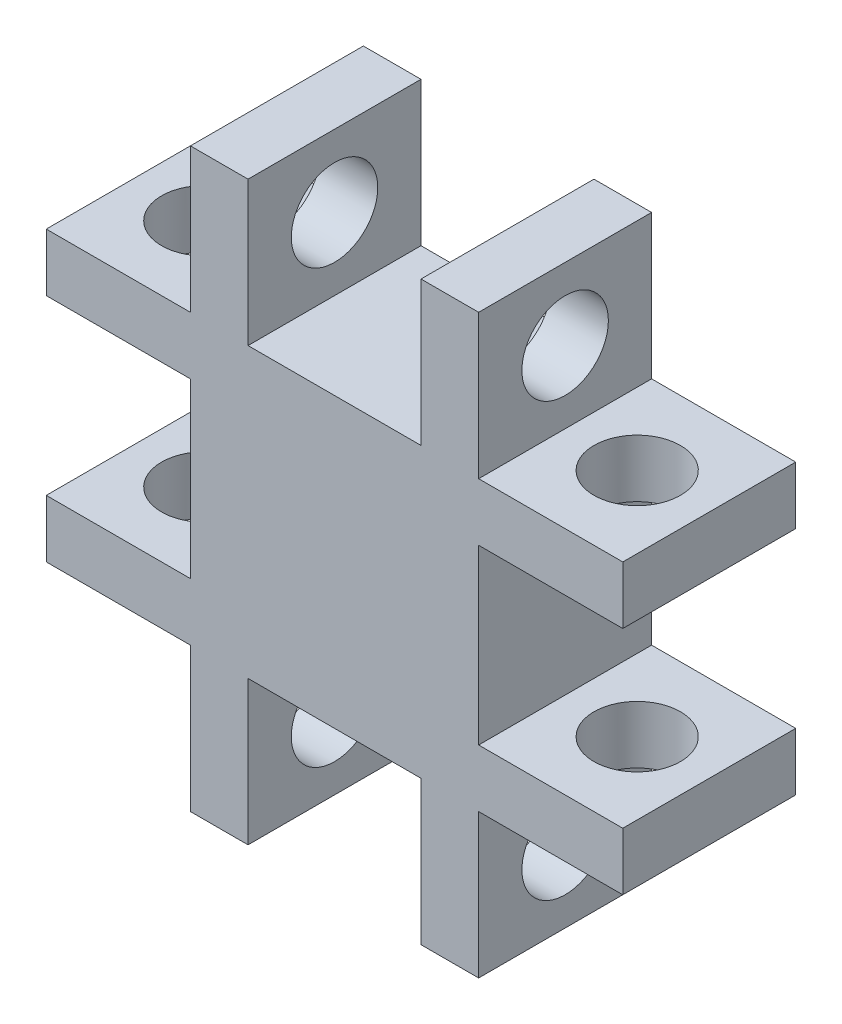
ISO-10303-21;
HEADER;
FILE_DESCRIPTION(('STEP AP214'),'2;1');
FILE_NAME('part.step','',(''),(''),'','','');
FILE_SCHEMA(('AUTOMOTIVE_DESIGN { 1 0 10303 214 1 1 1 1 }'));
ENDSEC;
DATA;
#1=APPLICATION_CONTEXT('core data for automotive mechanical design processes');
#2=APPLICATION_PROTOCOL_DEFINITION('international standard','automotive_design',2000,#1);
#3=PRODUCT_CONTEXT('',#1,'mechanical');
#4=PRODUCT('Part','Part','',(#3));
#5=PRODUCT_RELATED_PRODUCT_CATEGORY('part','',(#4));
#6=PRODUCT_DEFINITION_FORMATION('','',#4);
#7=PRODUCT_DEFINITION_CONTEXT('part definition',#1,'design');
#8=PRODUCT_DEFINITION('design','',#6,#7);
#9=PRODUCT_DEFINITION_SHAPE('','',#8);
#10=(LENGTH_UNIT() NAMED_UNIT(*) SI_UNIT(.MILLI.,.METRE.));
#11=(NAMED_UNIT(*) PLANE_ANGLE_UNIT() SI_UNIT($,.RADIAN.));
#12=(NAMED_UNIT(*) SI_UNIT($,.STERADIAN.) SOLID_ANGLE_UNIT());
#13=UNCERTAINTY_MEASURE_WITH_UNIT(LENGTH_MEASURE(1.E-05),#10,'distance_accuracy_value','');
#14=(GEOMETRIC_REPRESENTATION_CONTEXT(3) GLOBAL_UNCERTAINTY_ASSIGNED_CONTEXT((#13)) GLOBAL_UNIT_ASSIGNED_CONTEXT((#10,
#11,#12)) REPRESENTATION_CONTEXT('',''));
#15=CARTESIAN_POINT('',(0.,0.,0.));
#16=DIRECTION('',(0.,0.,1.));
#17=DIRECTION('',(1.,0.,0.));
#18=AXIS2_PLACEMENT_3D('',#15,#16,#17);
#19=CARTESIAN_POINT('',(-50.,50.,60.));
#20=DIRECTION('',(0.,-1.,0.));
#21=DIRECTION('',(0.,0.,-1.));
#22=AXIS2_PLACEMENT_3D('',#19,#20,#21);
#23=PLANE('',#22);
#24=CARTESIAN_POINT('',(75.,50.,30.));
#25=DIRECTION('',(0.,-1.,0.));
#26=DIRECTION('',(0.,0.,-1.));
#27=AXIS2_PLACEMENT_3D('',#24,#25,#26);
#28=CIRCLE('',#27,15.);
#29=CARTESIAN_POINT('',(75.,50.,15.));
#30=VERTEX_POINT('',#29);
#31=EDGE_CURVE('E406',#30,#30,#28,.T.);
#32=ORIENTED_EDGE('',*,*,#31,.T.);
#33=EDGE_LOOP('',(#32));
#34=FACE_BOUND('',#33,.T.);
#35=DIRECTION('',(-1.,0.,0.));
#36=VECTOR('',#35,1.);
#37=CARTESIAN_POINT('',(-50.,50.,0.));
#38=LINE('',#37,#36);
#39=CARTESIAN_POINT('',(100.,50.,0.));
#40=VERTEX_POINT('',#39);
#41=CARTESIAN_POINT('',(50.,50.,0.));
#42=VERTEX_POINT('',#41);
#43=EDGE_CURVE('E551',#40,#42,#38,.T.);
#44=ORIENTED_EDGE('',*,*,#43,.T.);
#45=DIRECTION('',(0.,0.,1.));
#46=VECTOR('',#45,1.);
#47=CARTESIAN_POINT('',(50.,50.,60.));
#48=LINE('',#47,#46);
#49=CARTESIAN_POINT('',(50.,50.,60.));
#50=VERTEX_POINT('',#49);
#51=EDGE_CURVE('E65',#42,#50,#48,.T.);
#52=ORIENTED_EDGE('',*,*,#51,.T.);
#53=DIRECTION('',(-1.,0.,0.));
#54=VECTOR('',#53,1.);
#55=CARTESIAN_POINT('',(-50.,50.,60.));
#56=LINE('',#55,#54);
#57=CARTESIAN_POINT('',(100.,50.,60.));
#58=VERTEX_POINT('',#57);
#59=EDGE_CURVE('E540',#58,#50,#56,.T.);
#60=ORIENTED_EDGE('',*,*,#59,.F.);
#61=DIRECTION('',(0.,0.,1.));
#62=VECTOR('',#61,1.);
#63=CARTESIAN_POINT('',(100.,50.,60.));
#64=LINE('',#63,#62);
#65=EDGE_CURVE('E519',#40,#58,#64,.T.);
#66=ORIENTED_EDGE('',*,*,#65,.F.);
#67=EDGE_LOOP('',(#44,#52,#60,#66));
#68=FACE_BOUND('',#67,.T.);
#69=ADVANCED_FACE('F39',(#34,#68),#23,.F.);
#70=CARTESIAN_POINT('',(-75.,49.9999999999999,30.));
#71=DIRECTION('',(0.,1.,0.));
#72=DIRECTION('',(0.,0.,-1.));
#73=AXIS2_PLACEMENT_3D('',#70,#71,#72);
#74=CIRCLE('',#73,15.);
#75=CARTESIAN_POINT('',(-75.,49.9999999999999,15.));
#76=VERTEX_POINT('',#75);
#77=EDGE_CURVE('E312',#76,#76,#74,.T.);
#78=ORIENTED_EDGE('',*,*,#77,.F.);
#79=EDGE_LOOP('',(#78));
#80=FACE_BOUND('',#79,.T.);
#81=CARTESIAN_POINT('',(-50.,50.,60.));
#82=VERTEX_POINT('',#81);
#83=CARTESIAN_POINT('',(-100.,50.,60.));
#84=VERTEX_POINT('',#83);
#85=EDGE_CURVE('E538',#82,#84,#56,.T.);
#86=ORIENTED_EDGE('',*,*,#85,.F.);
#87=DIRECTION('',(0.,0.,-1.));
#88=VECTOR('',#87,1.);
#89=CARTESIAN_POINT('',(-50.,50.,60.));
#90=LINE('',#89,#88);
#91=CARTESIAN_POINT('',(-50.,50.,0.));
#92=VERTEX_POINT('',#91);
#93=EDGE_CURVE('E237',#82,#92,#90,.T.);
#94=ORIENTED_EDGE('',*,*,#93,.T.);
#95=CARTESIAN_POINT('',(-100.,50.,0.));
#96=VERTEX_POINT('',#95);
#97=EDGE_CURVE('E550',#92,#96,#38,.T.);
#98=ORIENTED_EDGE('',*,*,#97,.T.);
#99=DIRECTION('',(0.,0.,1.));
#100=VECTOR('',#99,1.);
#101=CARTESIAN_POINT('',(-100.,50.,60.));
#102=LINE('',#101,#100);
#103=EDGE_CURVE('E371',#96,#84,#102,.T.);
#104=ORIENTED_EDGE('',*,*,#103,.T.);
#105=EDGE_LOOP('',(#86,#94,#98,#104));
#106=FACE_BOUND('',#105,.T.);
#107=ADVANCED_FACE('F588',(#80,#106),#23,.F.);
#108=CARTESIAN_POINT('',(-50.,50.,60.));
#109=DIRECTION('',(1.,0.,0.));
#110=DIRECTION('',(0.,1.,0.));
#111=AXIS2_PLACEMENT_3D('',#108,#109,#110);
#112=PLANE('',#111);
#113=DIRECTION('',(0.,-1.,0.));
#114=VECTOR('',#113,1.);
#115=CARTESIAN_POINT('',(-50.,50.,0.));
#116=LINE('',#115,#114);
#117=CARTESIAN_POINT('',(-50.,30.,0.));
#118=VERTEX_POINT('',#117);
#119=CARTESIAN_POINT('',(-50.,-30.,0.));
#120=VERTEX_POINT('',#119);
#121=EDGE_CURVE('E556',#118,#120,#116,.T.);
#122=ORIENTED_EDGE('',*,*,#121,.T.);
#123=DIRECTION('',(0.,0.,1.));
#124=VECTOR('',#123,1.);
#125=CARTESIAN_POINT('',(-50.,-30.,60.));
#126=LINE('',#125,#124);
#127=CARTESIAN_POINT('',(-50.,-30.,60.));
#128=VERTEX_POINT('',#127);
#129=EDGE_CURVE('E327',#120,#128,#126,.T.);
#130=ORIENTED_EDGE('',*,*,#129,.T.);
#131=DIRECTION('',(0.,-1.,0.));
#132=VECTOR('',#131,1.);
#133=CARTESIAN_POINT('',(-50.,50.,60.));
#134=LINE('',#133,#132);
#135=CARTESIAN_POINT('',(-50.,30.,60.));
#136=VERTEX_POINT('',#135);
#137=EDGE_CURVE('E544',#136,#128,#134,.T.);
#138=ORIENTED_EDGE('',*,*,#137,.F.);
#139=DIRECTION('',(0.,0.,-1.));
#140=VECTOR('',#139,1.);
#141=CARTESIAN_POINT('',(-50.,30.,60.));
#142=LINE('',#141,#140);
#143=EDGE_CURVE('E366',#136,#118,#142,.T.);
#144=ORIENTED_EDGE('',*,*,#143,.T.);
#145=EDGE_LOOP('',(#122,#130,#138,#144));
#146=FACE_BOUND('',#145,.T.);
#147=ADVANCED_FACE('F594',(#146),#112,.F.);
#148=CARTESIAN_POINT('',(-50.,-50.,60.));
#149=DIRECTION('',(0.,1.,0.));
#150=DIRECTION('',(0.,0.,1.));
#151=AXIS2_PLACEMENT_3D('',#148,#149,#150);
#152=PLANE('',#151);
#153=CARTESIAN_POINT('',(75.,-50.,30.));
#154=DIRECTION('',(0.,-1.,0.));
#155=DIRECTION('',(0.,0.,-1.));
#156=AXIS2_PLACEMENT_3D('',#153,#154,#155);
#157=CIRCLE('',#156,15.);
#158=CARTESIAN_POINT('',(75.,-50.,15.));
#159=VERTEX_POINT('',#158);
#160=EDGE_CURVE('E405',#159,#159,#157,.T.);
#161=ORIENTED_EDGE('',*,*,#160,.F.);
#162=EDGE_LOOP('',(#161));
#163=FACE_BOUND('',#162,.T.);
#164=DIRECTION('',(0.,0.,1.));
#165=VECTOR('',#164,1.);
#166=CARTESIAN_POINT('',(50.,-50.,60.));
#167=LINE('',#166,#165);
#168=CARTESIAN_POINT('',(50.,-50.,0.));
#169=VERTEX_POINT('',#168);
#170=CARTESIAN_POINT('',(50.,-50.,60.));
#171=VERTEX_POINT('',#170);
#172=EDGE_CURVE('E418',#169,#171,#167,.T.);
#173=ORIENTED_EDGE('',*,*,#172,.F.);
#174=DIRECTION('',(1.,0.,0.));
#175=VECTOR('',#174,1.);
#176=CARTESIAN_POINT('',(-50.,-50.,0.));
#177=LINE('',#176,#175);
#178=CARTESIAN_POINT('',(100.,-50.,0.));
#179=VERTEX_POINT('',#178);
#180=EDGE_CURVE('E559',#169,#179,#177,.T.);
#181=ORIENTED_EDGE('',*,*,#180,.T.);
#182=DIRECTION('',(0.,0.,-1.));
#183=VECTOR('',#182,1.);
#184=CARTESIAN_POINT('',(100.,-50.,60.));
#185=LINE('',#184,#183);
#186=CARTESIAN_POINT('',(100.,-50.,60.));
#187=VERTEX_POINT('',#186);
#188=EDGE_CURVE('E486',#187,#179,#185,.T.);
#189=ORIENTED_EDGE('',*,*,#188,.F.);
#190=DIRECTION('',(1.,0.,0.));
#191=VECTOR('',#190,1.);
#192=CARTESIAN_POINT('',(-50.,-50.,60.));
#193=LINE('',#192,#191);
#194=EDGE_CURVE('E49',#171,#187,#193,.T.);
#195=ORIENTED_EDGE('',*,*,#194,.F.);
#196=EDGE_LOOP('',(#173,#181,#189,#195));
#197=FACE_BOUND('',#196,.T.);
#198=ADVANCED_FACE('F610',(#163,#197),#152,.F.);
#199=DIRECTION('',(0.,0.,-1.));
#200=VECTOR('',#199,1.);
#201=CARTESIAN_POINT('',(30.,-50.,60.));
#202=LINE('',#201,#200);
#203=CARTESIAN_POINT('',(30.,-50.,60.));
#204=VERTEX_POINT('',#203);
#205=CARTESIAN_POINT('',(30.,-50.,0.));
#206=VERTEX_POINT('',#205);
#207=EDGE_CURVE('E424',#204,#206,#202,.T.);
#208=ORIENTED_EDGE('',*,*,#207,.F.);
#209=CARTESIAN_POINT('',(-30.,-50.,60.));
#210=VERTEX_POINT('',#209);
#211=EDGE_CURVE('E11',#210,#204,#193,.T.);
#212=ORIENTED_EDGE('',*,*,#211,.F.);
#213=DIRECTION('',(0.,0.,1.));
#214=VECTOR('',#213,1.);
#215=CARTESIAN_POINT('',(-30.,-50.,60.));
#216=LINE('',#215,#214);
#217=CARTESIAN_POINT('',(-30.,-50.,0.));
#218=VERTEX_POINT('',#217);
#219=EDGE_CURVE('E455',#218,#210,#216,.T.);
#220=ORIENTED_EDGE('',*,*,#219,.F.);
#221=EDGE_CURVE('E539',#218,#206,#177,.T.);
#222=ORIENTED_EDGE('',*,*,#221,.T.);
#223=EDGE_LOOP('',(#208,#212,#220,#222));
#224=FACE_BOUND('',#223,.T.);
#225=ADVANCED_FACE('F605',(#224),#152,.F.);
#226=CARTESIAN_POINT('',(50.,50.,60.));
#227=DIRECTION('',(-1.,0.,0.));
#228=DIRECTION('',(0.,-1.,0.));
#229=AXIS2_PLACEMENT_3D('',#226,#227,#228);
#230=PLANE('',#229);
#231=DIRECTION('',(0.,0.,1.));
#232=VECTOR('',#231,1.);
#233=CARTESIAN_POINT('',(50.,-30.,60.));
#234=LINE('',#233,#232);
#235=CARTESIAN_POINT('',(50.,-30.,0.));
#236=VERTEX_POINT('',#235);
#237=CARTESIAN_POINT('',(50.,-30.,60.));
#238=VERTEX_POINT('',#237);
#239=EDGE_CURVE('E481',#236,#238,#234,.T.);
#240=ORIENTED_EDGE('',*,*,#239,.F.);
#241=DIRECTION('',(0.,1.,0.));
#242=VECTOR('',#241,1.);
#243=CARTESIAN_POINT('',(50.,50.,0.));
#244=LINE('',#243,#242);
#245=CARTESIAN_POINT('',(50.,30.,0.));
#246=VERTEX_POINT('',#245);
#247=EDGE_CURVE('E534',#236,#246,#244,.T.);
#248=ORIENTED_EDGE('',*,*,#247,.T.);
#249=DIRECTION('',(0.,0.,-1.));
#250=VECTOR('',#249,1.);
#251=CARTESIAN_POINT('',(50.,30.,60.));
#252=LINE('',#251,#250);
#253=CARTESIAN_POINT('',(50.,30.,60.));
#254=VERTEX_POINT('',#253);
#255=EDGE_CURVE('E507',#254,#246,#252,.T.);
#256=ORIENTED_EDGE('',*,*,#255,.F.);
#257=DIRECTION('',(0.,1.,0.));
#258=VECTOR('',#257,1.);
#259=CARTESIAN_POINT('',(50.,50.,60.));
#260=LINE('',#259,#258);
#261=EDGE_CURVE('E535',#238,#254,#260,.T.);
#262=ORIENTED_EDGE('',*,*,#261,.F.);
#263=EDGE_LOOP('',(#240,#248,#256,#262));
#264=FACE_BOUND('',#263,.T.);
#265=ADVANCED_FACE('F41',(#264),#230,.F.);
#266=CARTESIAN_POINT('',(30.,50.,60.));
#267=VERTEX_POINT('',#266);
#268=CARTESIAN_POINT('',(-30.,50.,60.));
#269=VERTEX_POINT('',#268);
#270=EDGE_CURVE('E57',#267,#269,#56,.T.);
#271=ORIENTED_EDGE('',*,*,#270,.F.);
#272=DIRECTION('',(0.,0.,-1.));
#273=VECTOR('',#272,1.);
#274=CARTESIAN_POINT('',(30.,50.,60.));
#275=LINE('',#274,#273);
#276=CARTESIAN_POINT('',(30.,50.,0.));
#277=VERTEX_POINT('',#276);
#278=EDGE_CURVE('E249',#267,#277,#275,.T.);
#279=ORIENTED_EDGE('',*,*,#278,.T.);
#280=CARTESIAN_POINT('',(-30.,50.,0.));
#281=VERTEX_POINT('',#280);
#282=EDGE_CURVE('E555',#277,#281,#38,.T.);
#283=ORIENTED_EDGE('',*,*,#282,.T.);
#284=DIRECTION('',(0.,0.,1.));
#285=VECTOR('',#284,1.);
#286=CARTESIAN_POINT('',(-30.,50.,60.));
#287=LINE('',#286,#285);
#288=EDGE_CURVE('E280',#281,#269,#287,.T.);
#289=ORIENTED_EDGE('',*,*,#288,.T.);
#290=EDGE_LOOP('',(#271,#279,#283,#289));
#291=FACE_BOUND('',#290,.T.);
#292=ADVANCED_FACE('F590',(#291),#23,.F.);
#293=CARTESIAN_POINT('',(-50.,-75.,30.));
#294=DIRECTION('',(1.,0.,0.));
#295=DIRECTION('',(0.,0.,-1.));
#296=AXIS2_PLACEMENT_3D('',#293,#294,#295);
#297=CIRCLE('',#296,15.);
#298=CARTESIAN_POINT('',(-50.,-75.,15.));
#299=VERTEX_POINT('',#298);
#300=EDGE_CURVE('E393',#299,#299,#297,.T.);
#301=ORIENTED_EDGE('',*,*,#300,.T.);
#302=EDGE_LOOP('',(#301));
#303=FACE_BOUND('',#302,.T.);
#304=CARTESIAN_POINT('',(-50.,-50.,60.));
#305=VERTEX_POINT('',#304);
#306=CARTESIAN_POINT('',(-50.,-100.,60.));
#307=VERTEX_POINT('',#306);
#308=EDGE_CURVE('E543',#305,#307,#134,.T.);
#309=ORIENTED_EDGE('',*,*,#308,.F.);
#310=DIRECTION('',(0.,0.,-1.));
#311=VECTOR('',#310,1.);
#312=CARTESIAN_POINT('',(-50.,-50.,60.));
#313=LINE('',#312,#311);
#314=CARTESIAN_POINT('',(-50.,-50.,0.));
#315=VERTEX_POINT('',#314);
#316=EDGE_CURVE('E333',#305,#315,#313,.T.);
#317=ORIENTED_EDGE('',*,*,#316,.T.);
#318=CARTESIAN_POINT('',(-50.,-100.,0.));
#319=VERTEX_POINT('',#318);
#320=EDGE_CURVE('E554',#315,#319,#116,.T.);
#321=ORIENTED_EDGE('',*,*,#320,.T.);
#322=DIRECTION('',(0.,0.,-1.));
#323=VECTOR('',#322,1.);
#324=CARTESIAN_POINT('',(-50.,-100.,60.));
#325=LINE('',#324,#323);
#326=EDGE_CURVE('E456',#307,#319,#325,.T.);
#327=ORIENTED_EDGE('',*,*,#326,.F.);
#328=EDGE_LOOP('',(#309,#317,#321,#327));
#329=FACE_BOUND('',#328,.T.);
#330=ADVANCED_FACE('F598',(#303,#329),#112,.F.);
#331=CARTESIAN_POINT('',(0.,0.,60.));
#332=DIRECTION('',(0.,0.,1.));
#333=DIRECTION('',(1.,0.,0.));
#334=AXIS2_PLACEMENT_3D('',#331,#332,#333);
#335=PLANE('',#334);
#336=ORIENTED_EDGE('',*,*,#59,.T.);
#337=DIRECTION('',(0.,-1.,0.));
#338=VECTOR('',#337,1.);
#339=CARTESIAN_POINT('',(50.,100.,60.));
#340=LINE('',#339,#338);
#341=CARTESIAN_POINT('',(50.,100.,60.));
#342=VERTEX_POINT('',#341);
#343=EDGE_CURVE('E262',#342,#50,#340,.T.);
#344=ORIENTED_EDGE('',*,*,#343,.F.);
#345=DIRECTION('',(-1.,0.,0.));
#346=VECTOR('',#345,1.);
#347=CARTESIAN_POINT('',(50.,100.,60.));
#348=LINE('',#347,#346);
#349=CARTESIAN_POINT('',(30.,100.,60.));
#350=VERTEX_POINT('',#349);
#351=EDGE_CURVE('E247',#342,#350,#348,.T.);
#352=ORIENTED_EDGE('',*,*,#351,.T.);
#353=DIRECTION('',(0.,-1.,0.));
#354=VECTOR('',#353,1.);
#355=CARTESIAN_POINT('',(30.,100.,60.));
#356=LINE('',#355,#354);
#357=EDGE_CURVE('E270',#350,#267,#356,.T.);
#358=ORIENTED_EDGE('',*,*,#357,.T.);
#359=ORIENTED_EDGE('',*,*,#270,.T.);
#360=DIRECTION('',(0.,-1.,0.));
#361=VECTOR('',#360,1.);
#362=CARTESIAN_POINT('',(-30.,100.,60.));
#363=LINE('',#362,#361);
#364=CARTESIAN_POINT('',(-30.,100.,60.));
#365=VERTEX_POINT('',#364);
#366=EDGE_CURVE('E304',#365,#269,#363,.T.);
#367=ORIENTED_EDGE('',*,*,#366,.F.);
#368=DIRECTION('',(-1.,0.,0.));
#369=VECTOR('',#368,1.);
#370=CARTESIAN_POINT('',(-50.,100.,60.));
#371=LINE('',#370,#369);
#372=CARTESIAN_POINT('',(-50.,100.,60.));
#373=VERTEX_POINT('',#372);
#374=EDGE_CURVE('E279',#365,#373,#371,.T.);
#375=ORIENTED_EDGE('',*,*,#374,.T.);
#376=DIRECTION('',(0.,-1.,0.));
#377=VECTOR('',#376,1.);
#378=CARTESIAN_POINT('',(-50.,100.,60.));
#379=LINE('',#378,#377);
#380=EDGE_CURVE('E308',#373,#82,#379,.T.);
#381=ORIENTED_EDGE('',*,*,#380,.T.);
#382=ORIENTED_EDGE('',*,*,#85,.T.);
#383=DIRECTION('',(0.,-1.,0.));
#384=VECTOR('',#383,1.);
#385=CARTESIAN_POINT('',(-100.,50.,60.));
#386=LINE('',#385,#384);
#387=CARTESIAN_POINT('',(-100.,30.,60.));
#388=VERTEX_POINT('',#387);
#389=EDGE_CURVE('E367',#84,#388,#386,.T.);
#390=ORIENTED_EDGE('',*,*,#389,.T.);
#391=DIRECTION('',(1.,0.,0.));
#392=VECTOR('',#391,1.);
#393=CARTESIAN_POINT('',(-100.,30.,60.));
#394=LINE('',#393,#392);
#395=EDGE_CURVE('E383',#388,#136,#394,.T.);
#396=ORIENTED_EDGE('',*,*,#395,.T.);
#397=ORIENTED_EDGE('',*,*,#137,.T.);
#398=DIRECTION('',(1.,0.,0.));
#399=VECTOR('',#398,1.);
#400=CARTESIAN_POINT('',(-100.,-30.,60.));
#401=LINE('',#400,#399);
#402=CARTESIAN_POINT('',(-100.,-30.,60.));
#403=VERTEX_POINT('',#402);
#404=EDGE_CURVE('E362',#403,#128,#401,.T.);
#405=ORIENTED_EDGE('',*,*,#404,.F.);
#406=DIRECTION('',(0.,-1.,0.));
#407=VECTOR('',#406,1.);
#408=CARTESIAN_POINT('',(-100.,-50.,60.));
#409=LINE('',#408,#407);
#410=CARTESIAN_POINT('',(-100.,-50.,60.));
#411=VERTEX_POINT('',#410);
#412=EDGE_CURVE('E328',#403,#411,#409,.T.);
#413=ORIENTED_EDGE('',*,*,#412,.T.);
#414=DIRECTION('',(1.,0.,0.));
#415=VECTOR('',#414,1.);
#416=CARTESIAN_POINT('',(-100.,-50.,60.));
#417=LINE('',#416,#415);
#418=EDGE_CURVE('E345',#411,#305,#417,.T.);
#419=ORIENTED_EDGE('',*,*,#418,.T.);
#420=ORIENTED_EDGE('',*,*,#308,.T.);
#421=DIRECTION('',(-1.,0.,0.));
#422=VECTOR('',#421,1.);
#423=CARTESIAN_POINT('',(-50.,-100.,60.));
#424=LINE('',#423,#422);
#425=CARTESIAN_POINT('',(-30.,-100.,60.));
#426=VERTEX_POINT('',#425);
#427=EDGE_CURVE('E466',#426,#307,#424,.T.);
#428=ORIENTED_EDGE('',*,*,#427,.F.);
#429=DIRECTION('',(0.,1.,0.));
#430=VECTOR('',#429,1.);
#431=CARTESIAN_POINT('',(-30.,-100.,60.));
#432=LINE('',#431,#430);
#433=EDGE_CURVE('E470',#426,#210,#432,.T.);
#434=ORIENTED_EDGE('',*,*,#433,.T.);
#435=ORIENTED_EDGE('',*,*,#211,.T.);
#436=DIRECTION('',(0.,1.,0.));
#437=VECTOR('',#436,1.);
#438=CARTESIAN_POINT('',(30.,-100.,60.));
#439=LINE('',#438,#437);
#440=CARTESIAN_POINT('',(30.,-100.,60.));
#441=VERTEX_POINT('',#440);
#442=EDGE_CURVE('E447',#441,#204,#439,.T.);
#443=ORIENTED_EDGE('',*,*,#442,.F.);
#444=DIRECTION('',(-1.,0.,0.));
#445=VECTOR('',#444,1.);
#446=CARTESIAN_POINT('',(50.,-100.,60.));
#447=LINE('',#446,#445);
#448=CARTESIAN_POINT('',(50.,-100.,60.));
#449=VERTEX_POINT('',#448);
#450=EDGE_CURVE('E423',#449,#441,#447,.T.);
#451=ORIENTED_EDGE('',*,*,#450,.F.);
#452=DIRECTION('',(0.,1.,0.));
#453=VECTOR('',#452,1.);
#454=CARTESIAN_POINT('',(50.,-100.,60.));
#455=LINE('',#454,#453);
#456=EDGE_CURVE('E451',#449,#171,#455,.T.);
#457=ORIENTED_EDGE('',*,*,#456,.T.);
#458=ORIENTED_EDGE('',*,*,#194,.T.);
#459=DIRECTION('',(0.,-1.,0.));
#460=VECTOR('',#459,1.);
#461=CARTESIAN_POINT('',(100.,-50.,60.));
#462=LINE('',#461,#460);
#463=CARTESIAN_POINT('',(100.,-30.,60.));
#464=VERTEX_POINT('',#463);
#465=EDGE_CURVE('E482',#464,#187,#462,.T.);
#466=ORIENTED_EDGE('',*,*,#465,.F.);
#467=DIRECTION('',(-1.,0.,0.));
#468=VECTOR('',#467,1.);
#469=CARTESIAN_POINT('',(100.,-30.,60.));
#470=LINE('',#469,#468);
#471=EDGE_CURVE('E496',#464,#238,#470,.T.);
#472=ORIENTED_EDGE('',*,*,#471,.T.);
#473=ORIENTED_EDGE('',*,*,#261,.T.);
#474=DIRECTION('',(-1.,0.,0.));
#475=VECTOR('',#474,1.);
#476=CARTESIAN_POINT('',(100.,30.,60.));
#477=LINE('',#476,#475);
#478=CARTESIAN_POINT('',(100.,30.,60.));
#479=VERTEX_POINT('',#478);
#480=EDGE_CURVE('E530',#479,#254,#477,.T.);
#481=ORIENTED_EDGE('',*,*,#480,.F.);
#482=DIRECTION('',(0.,-1.,0.));
#483=VECTOR('',#482,1.);
#484=CARTESIAN_POINT('',(100.,50.,60.));
#485=LINE('',#484,#483);
#486=EDGE_CURVE('E508',#58,#479,#485,.T.);
#487=ORIENTED_EDGE('',*,*,#486,.F.);
#488=EDGE_LOOP('',(#336,#344,#352,#358,#359,#367,#375,#381,#382,#390,#396,#397,#405,#413,#419,
#420,#428,#434,#435,#443,#451,#457,#458,#466,#472,#473,#481,#487));
#489=FACE_BOUND('',#488,.T.);
#490=ADVANCED_FACE('F603',(#489),#335,.T.);
#491=CARTESIAN_POINT('',(0.,0.,0.));
#492=DIRECTION('',(0.,0.,1.));
#493=DIRECTION('',(1.,0.,0.));
#494=AXIS2_PLACEMENT_3D('',#491,#492,#493);
#495=PLANE('',#494);
#496=ORIENTED_EDGE('',*,*,#247,.F.);
#497=DIRECTION('',(-1.,0.,0.));
#498=VECTOR('',#497,1.);
#499=CARTESIAN_POINT('',(100.,-30.,0.));
#500=LINE('',#499,#498);
#501=CARTESIAN_POINT('',(100.,-30.,0.));
#502=VERTEX_POINT('',#501);
#503=EDGE_CURVE('E503',#502,#236,#500,.T.);
#504=ORIENTED_EDGE('',*,*,#503,.F.);
#505=DIRECTION('',(0.,1.,0.));
#506=VECTOR('',#505,1.);
#507=CARTESIAN_POINT('',(100.,-50.,0.));
#508=LINE('',#507,#506);
#509=EDGE_CURVE('E490',#179,#502,#508,.T.);
#510=ORIENTED_EDGE('',*,*,#509,.F.);
#511=ORIENTED_EDGE('',*,*,#180,.F.);
#512=DIRECTION('',(0.,1.,0.));
#513=VECTOR('',#512,1.);
#514=CARTESIAN_POINT('',(50.,-100.,0.));
#515=LINE('',#514,#513);
#516=CARTESIAN_POINT('',(50.,-100.,0.));
#517=VERTEX_POINT('',#516);
#518=EDGE_CURVE('E433',#517,#169,#515,.T.);
#519=ORIENTED_EDGE('',*,*,#518,.F.);
#520=DIRECTION('',(1.,0.,0.));
#521=VECTOR('',#520,1.);
#522=CARTESIAN_POINT('',(50.,-100.,0.));
#523=LINE('',#522,#521);
#524=CARTESIAN_POINT('',(30.,-100.,0.));
#525=VERTEX_POINT('',#524);
#526=EDGE_CURVE('E430',#525,#517,#523,.T.);
#527=ORIENTED_EDGE('',*,*,#526,.F.);
#528=DIRECTION('',(0.,1.,0.));
#529=VECTOR('',#528,1.);
#530=CARTESIAN_POINT('',(30.,-100.,0.));
#531=LINE('',#530,#529);
#532=EDGE_CURVE('E443',#525,#206,#531,.T.);
#533=ORIENTED_EDGE('',*,*,#532,.T.);
#534=ORIENTED_EDGE('',*,*,#221,.F.);
#535=DIRECTION('',(0.,1.,0.));
#536=VECTOR('',#535,1.);
#537=CARTESIAN_POINT('',(-30.,-100.,0.));
#538=LINE('',#537,#536);
#539=CARTESIAN_POINT('',(-30.,-100.,0.));
#540=VERTEX_POINT('',#539);
#541=EDGE_CURVE('E477',#540,#218,#538,.T.);
#542=ORIENTED_EDGE('',*,*,#541,.F.);
#543=DIRECTION('',(1.,0.,0.));
#544=VECTOR('',#543,1.);
#545=CARTESIAN_POINT('',(-50.,-100.,0.));
#546=LINE('',#545,#544);
#547=EDGE_CURVE('E460',#319,#540,#546,.T.);
#548=ORIENTED_EDGE('',*,*,#547,.F.);
#549=ORIENTED_EDGE('',*,*,#320,.F.);
#550=DIRECTION('',(1.,0.,0.));
#551=VECTOR('',#550,1.);
#552=CARTESIAN_POINT('',(-100.,-50.,0.));
#553=LINE('',#552,#551);
#554=CARTESIAN_POINT('',(-100.,-50.,0.));
#555=VERTEX_POINT('',#554);
#556=EDGE_CURVE('E354',#555,#315,#553,.T.);
#557=ORIENTED_EDGE('',*,*,#556,.F.);
#558=DIRECTION('',(0.,1.,0.));
#559=VECTOR('',#558,1.);
#560=CARTESIAN_POINT('',(-100.,-50.,0.));
#561=LINE('',#560,#559);
#562=CARTESIAN_POINT('',(-100.,-30.,0.));
#563=VERTEX_POINT('',#562);
#564=EDGE_CURVE('E337',#555,#563,#561,.T.);
#565=ORIENTED_EDGE('',*,*,#564,.T.);
#566=DIRECTION('',(1.,0.,0.));
#567=VECTOR('',#566,1.);
#568=CARTESIAN_POINT('',(-100.,-30.,0.));
#569=LINE('',#568,#567);
#570=EDGE_CURVE('E358',#563,#120,#569,.T.);
#571=ORIENTED_EDGE('',*,*,#570,.T.);
#572=ORIENTED_EDGE('',*,*,#121,.F.);
#573=DIRECTION('',(1.,0.,0.));
#574=VECTOR('',#573,1.);
#575=CARTESIAN_POINT('',(-100.,30.,0.));
#576=LINE('',#575,#574);
#577=CARTESIAN_POINT('',(-100.,30.,0.));
#578=VERTEX_POINT('',#577);
#579=EDGE_CURVE('E389',#578,#118,#576,.T.);
#580=ORIENTED_EDGE('',*,*,#579,.F.);
#581=DIRECTION('',(0.,1.,0.));
#582=VECTOR('',#581,1.);
#583=CARTESIAN_POINT('',(-100.,50.,0.));
#584=LINE('',#583,#582);
#585=EDGE_CURVE('E375',#578,#96,#584,.T.);
#586=ORIENTED_EDGE('',*,*,#585,.T.);
#587=ORIENTED_EDGE('',*,*,#97,.F.);
#588=DIRECTION('',(0.,-1.,0.));
#589=VECTOR('',#588,1.);
#590=CARTESIAN_POINT('',(-50.,100.,0.));
#591=LINE('',#590,#589);
#592=CARTESIAN_POINT('',(-50.,100.,0.));
#593=VERTEX_POINT('',#592);
#594=EDGE_CURVE('E292',#593,#92,#591,.T.);
#595=ORIENTED_EDGE('',*,*,#594,.F.);
#596=DIRECTION('',(1.,0.,0.));
#597=VECTOR('',#596,1.);
#598=CARTESIAN_POINT('',(-50.,100.,0.));
#599=LINE('',#598,#597);
#600=CARTESIAN_POINT('',(-30.,100.,0.));
#601=VERTEX_POINT('',#600);
#602=EDGE_CURVE('E288',#593,#601,#599,.T.);
#603=ORIENTED_EDGE('',*,*,#602,.T.);
#604=DIRECTION('',(0.,-1.,0.));
#605=VECTOR('',#604,1.);
#606=CARTESIAN_POINT('',(-30.,100.,0.));
#607=LINE('',#606,#605);
#608=EDGE_CURVE('E300',#601,#281,#607,.T.);
#609=ORIENTED_EDGE('',*,*,#608,.T.);
#610=ORIENTED_EDGE('',*,*,#282,.F.);
#611=DIRECTION('',(0.,-1.,0.));
#612=VECTOR('',#611,1.);
#613=CARTESIAN_POINT('',(30.,100.,0.));
#614=LINE('',#613,#612);
#615=CARTESIAN_POINT('',(30.,100.,0.));
#616=VERTEX_POINT('',#615);
#617=EDGE_CURVE('E238',#616,#277,#614,.T.);
#618=ORIENTED_EDGE('',*,*,#617,.F.);
#619=DIRECTION('',(1.,0.,0.));
#620=VECTOR('',#619,1.);
#621=CARTESIAN_POINT('',(50.,100.,0.));
#622=LINE('',#621,#620);
#623=CARTESIAN_POINT('',(50.,100.,0.));
#624=VERTEX_POINT('',#623);
#625=EDGE_CURVE('E244',#616,#624,#622,.T.);
#626=ORIENTED_EDGE('',*,*,#625,.T.);
#627=DIRECTION('',(0.,-1.,0.));
#628=VECTOR('',#627,1.);
#629=CARTESIAN_POINT('',(50.,100.,0.));
#630=LINE('',#629,#628);
#631=EDGE_CURVE('E228',#624,#42,#630,.T.);
#632=ORIENTED_EDGE('',*,*,#631,.T.);
#633=ORIENTED_EDGE('',*,*,#43,.F.);
#634=DIRECTION('',(0.,1.,0.));
#635=VECTOR('',#634,1.);
#636=CARTESIAN_POINT('',(100.,50.,0.));
#637=LINE('',#636,#635);
#638=CARTESIAN_POINT('',(100.,30.,0.));
#639=VERTEX_POINT('',#638);
#640=EDGE_CURVE('E515',#639,#40,#637,.T.);
#641=ORIENTED_EDGE('',*,*,#640,.F.);
#642=DIRECTION('',(-1.,0.,0.));
#643=VECTOR('',#642,1.);
#644=CARTESIAN_POINT('',(100.,30.,0.));
#645=LINE('',#644,#643);
#646=EDGE_CURVE('E523',#639,#246,#645,.T.);
#647=ORIENTED_EDGE('',*,*,#646,.T.);
#648=EDGE_LOOP('',(#496,#504,#510,#511,#519,#527,#533,#534,#542,#548,#549,#557,#565,#571,#572,
#580,#586,#587,#595,#603,#609,#610,#618,#626,#632,#633,#641,#647));
#649=FACE_BOUND('',#648,.T.);
#650=ADVANCED_FACE('F251',(#649),#495,.F.);
#651=CARTESIAN_POINT('',(100.,30.,60.));
#652=DIRECTION('',(0.,1.,0.));
#653=DIRECTION('',(-1.,0.,0.));
#654=AXIS2_PLACEMENT_3D('',#651,#652,#653);
#655=PLANE('',#654);
#656=CARTESIAN_POINT('',(75.,30.,30.));
#657=DIRECTION('',(0.,1.,0.));
#658=DIRECTION('',(-1.,0.,0.));
#659=AXIS2_PLACEMENT_3D('',#656,#657,#658);
#660=CIRCLE('',#659,15.);
#661=CARTESIAN_POINT('',(60.,30.,30.));
#662=VERTEX_POINT('',#661);
#663=EDGE_CURVE('E414',#662,#662,#660,.T.);
#664=ORIENTED_EDGE('',*,*,#663,.T.);
#665=EDGE_LOOP('',(#664));
#666=FACE_BOUND('',#665,.T.);
#667=ORIENTED_EDGE('',*,*,#255,.T.);
#668=ORIENTED_EDGE('',*,*,#646,.F.);
#669=DIRECTION('',(0.,0.,-1.));
#670=VECTOR('',#669,1.);
#671=CARTESIAN_POINT('',(100.,30.,60.));
#672=LINE('',#671,#670);
#673=EDGE_CURVE('E512',#479,#639,#672,.T.);
#674=ORIENTED_EDGE('',*,*,#673,.F.);
#675=ORIENTED_EDGE('',*,*,#480,.T.);
#676=EDGE_LOOP('',(#667,#668,#674,#675));
#677=FACE_BOUND('',#676,.T.);
#678=ADVANCED_FACE('F624',(#666,#677),#655,.F.);
#679=CARTESIAN_POINT('',(100.,0.,0.));
#680=DIRECTION('',(1.,0.,0.));
#681=DIRECTION('',(0.,0.,-1.));
#682=AXIS2_PLACEMENT_3D('',#679,#680,#681);
#683=PLANE('',#682);
#684=ORIENTED_EDGE('',*,*,#486,.T.);
#685=ORIENTED_EDGE('',*,*,#673,.T.);
#686=ORIENTED_EDGE('',*,*,#640,.T.);
#687=ORIENTED_EDGE('',*,*,#65,.T.);
#688=EDGE_LOOP('',(#684,#685,#686,#687));
#689=FACE_BOUND('',#688,.T.);
#690=ADVANCED_FACE('F708',(#689),#683,.T.);
#691=CARTESIAN_POINT('',(100.,-30.,60.));
#692=DIRECTION('',(0.,-1.,0.));
#693=DIRECTION('',(1.,0.,0.));
#694=AXIS2_PLACEMENT_3D('',#691,#692,#693);
#695=PLANE('',#694);
#696=CARTESIAN_POINT('',(75.,-30.,30.));
#697=DIRECTION('',(0.,-1.,0.));
#698=DIRECTION('',(1.,0.,0.));
#699=AXIS2_PLACEMENT_3D('',#696,#697,#698);
#700=CIRCLE('',#699,15.);
#701=CARTESIAN_POINT('',(90.,-30.,30.));
#702=VERTEX_POINT('',#701);
#703=EDGE_CURVE('E410',#702,#702,#700,.T.);
#704=ORIENTED_EDGE('',*,*,#703,.T.);
#705=EDGE_LOOP('',(#704));
#706=FACE_BOUND('',#705,.T.);
#707=ORIENTED_EDGE('',*,*,#239,.T.);
#708=ORIENTED_EDGE('',*,*,#471,.F.);
#709=DIRECTION('',(0.,0.,1.));
#710=VECTOR('',#709,1.);
#711=CARTESIAN_POINT('',(100.,-30.,60.));
#712=LINE('',#711,#710);
#713=EDGE_CURVE('E493',#502,#464,#712,.T.);
#714=ORIENTED_EDGE('',*,*,#713,.F.);
#715=ORIENTED_EDGE('',*,*,#503,.T.);
#716=EDGE_LOOP('',(#707,#708,#714,#715));
#717=FACE_BOUND('',#716,.T.);
#718=ADVANCED_FACE('F619',(#706,#717),#695,.F.);
#719=CARTESIAN_POINT('',(100.,0.,0.));
#720=DIRECTION('',(-1.,0.,0.));
#721=DIRECTION('',(0.,-1.,0.));
#722=AXIS2_PLACEMENT_3D('',#719,#720,#721);
#723=PLANE('',#722);
#724=ORIENTED_EDGE('',*,*,#465,.T.);
#725=ORIENTED_EDGE('',*,*,#188,.T.);
#726=ORIENTED_EDGE('',*,*,#509,.T.);
#727=ORIENTED_EDGE('',*,*,#713,.T.);
#728=EDGE_LOOP('',(#724,#725,#726,#727));
#729=FACE_BOUND('',#728,.T.);
#730=ADVANCED_FACE('F631',(#729),#723,.F.);
#731=CARTESIAN_POINT('',(-30.,-100.,60.));
#732=DIRECTION('',(-1.,0.,0.));
#733=DIRECTION('',(0.,0.,1.));
#734=AXIS2_PLACEMENT_3D('',#731,#732,#733);
#735=PLANE('',#734);
#736=CARTESIAN_POINT('',(-30.,-75.,30.));
#737=DIRECTION('',(-1.,0.,0.));
#738=DIRECTION('',(0.,0.,1.));
#739=AXIS2_PLACEMENT_3D('',#736,#737,#738);
#740=CIRCLE('',#739,15.);
#741=CARTESIAN_POINT('',(-30.,-75.,45.));
#742=VERTEX_POINT('',#741);
#743=EDGE_CURVE('E401',#742,#742,#740,.T.);
#744=ORIENTED_EDGE('',*,*,#743,.T.);
#745=EDGE_LOOP('',(#744));
#746=FACE_BOUND('',#745,.T.);
#747=ORIENTED_EDGE('',*,*,#219,.T.);
#748=ORIENTED_EDGE('',*,*,#433,.F.);
#749=DIRECTION('',(0.,0.,1.));
#750=VECTOR('',#749,1.);
#751=CARTESIAN_POINT('',(-30.,-100.,60.));
#752=LINE('',#751,#750);
#753=EDGE_CURVE('E463',#540,#426,#752,.T.);
#754=ORIENTED_EDGE('',*,*,#753,.F.);
#755=ORIENTED_EDGE('',*,*,#541,.T.);
#756=EDGE_LOOP('',(#747,#748,#754,#755));
#757=FACE_BOUND('',#756,.T.);
#758=ADVANCED_FACE('F678',(#746,#757),#735,.F.);
#759=CARTESIAN_POINT('',(0.,-100.,0.));
#760=DIRECTION('',(0.,-1.,0.));
#761=DIRECTION('',(0.,0.,-1.));
#762=AXIS2_PLACEMENT_3D('',#759,#760,#761);
#763=PLANE('',#762);
#764=ORIENTED_EDGE('',*,*,#326,.T.);
#765=ORIENTED_EDGE('',*,*,#547,.T.);
#766=ORIENTED_EDGE('',*,*,#753,.T.);
#767=ORIENTED_EDGE('',*,*,#427,.T.);
#768=EDGE_LOOP('',(#764,#765,#766,#767));
#769=FACE_BOUND('',#768,.T.);
#770=ADVANCED_FACE('F672',(#769),#763,.T.);
#771=CARTESIAN_POINT('',(50.,-100.,60.));
#772=DIRECTION('',(-1.,0.,0.));
#773=DIRECTION('',(0.,0.,1.));
#774=AXIS2_PLACEMENT_3D('',#771,#772,#773);
#775=PLANE('',#774);
#776=CARTESIAN_POINT('',(50.,-75.,30.));
#777=DIRECTION('',(1.,0.,0.));
#778=DIRECTION('',(0.,0.,-1.));
#779=AXIS2_PLACEMENT_3D('',#776,#777,#778);
#780=CIRCLE('',#779,15.);
#781=CARTESIAN_POINT('',(50.,-75.,15.));
#782=VERTEX_POINT('',#781);
#783=EDGE_CURVE('E392',#782,#782,#780,.T.);
#784=ORIENTED_EDGE('',*,*,#783,.F.);
#785=EDGE_LOOP('',(#784));
#786=FACE_BOUND('',#785,.T.);
#787=ORIENTED_EDGE('',*,*,#172,.T.);
#788=ORIENTED_EDGE('',*,*,#456,.F.);
#789=DIRECTION('',(0.,0.,1.));
#790=VECTOR('',#789,1.);
#791=CARTESIAN_POINT('',(50.,-100.,60.));
#792=LINE('',#791,#790);
#793=EDGE_CURVE('E419',#517,#449,#792,.T.);
#794=ORIENTED_EDGE('',*,*,#793,.F.);
#795=ORIENTED_EDGE('',*,*,#518,.T.);
#796=EDGE_LOOP('',(#787,#788,#794,#795));
#797=FACE_BOUND('',#796,.T.);
#798=ADVANCED_FACE('F688',(#786,#797),#775,.F.);
#799=CARTESIAN_POINT('',(30.,-100.,60.));
#800=DIRECTION('',(1.,0.,0.));
#801=DIRECTION('',(0.,0.,-1.));
#802=AXIS2_PLACEMENT_3D('',#799,#800,#801);
#803=PLANE('',#802);
#804=CARTESIAN_POINT('',(30.,-75.,30.));
#805=DIRECTION('',(1.,0.,0.));
#806=DIRECTION('',(0.,0.,-1.));
#807=AXIS2_PLACEMENT_3D('',#804,#805,#806);
#808=CIRCLE('',#807,15.);
#809=CARTESIAN_POINT('',(30.,-75.,15.));
#810=VERTEX_POINT('',#809);
#811=EDGE_CURVE('E397',#810,#810,#808,.T.);
#812=ORIENTED_EDGE('',*,*,#811,.T.);
#813=EDGE_LOOP('',(#812));
#814=FACE_BOUND('',#813,.T.);
#815=ORIENTED_EDGE('',*,*,#207,.T.);
#816=ORIENTED_EDGE('',*,*,#532,.F.);
#817=DIRECTION('',(0.,0.,-1.));
#818=VECTOR('',#817,1.);
#819=CARTESIAN_POINT('',(30.,-100.,60.));
#820=LINE('',#819,#818);
#821=EDGE_CURVE('E427',#441,#525,#820,.T.);
#822=ORIENTED_EDGE('',*,*,#821,.F.);
#823=ORIENTED_EDGE('',*,*,#442,.T.);
#824=EDGE_LOOP('',(#815,#816,#822,#823));
#825=FACE_BOUND('',#824,.T.);
#826=ADVANCED_FACE('F568',(#814,#825),#803,.F.);
#827=CARTESIAN_POINT('',(0.,-100.,0.));
#828=DIRECTION('',(0.,1.,0.));
#829=DIRECTION('',(0.,0.,1.));
#830=AXIS2_PLACEMENT_3D('',#827,#828,#829);
#831=PLANE('',#830);
#832=ORIENTED_EDGE('',*,*,#793,.T.);
#833=ORIENTED_EDGE('',*,*,#450,.T.);
#834=ORIENTED_EDGE('',*,*,#821,.T.);
#835=ORIENTED_EDGE('',*,*,#526,.T.);
#836=EDGE_LOOP('',(#832,#833,#834,#835));
#837=FACE_BOUND('',#836,.T.);
#838=ADVANCED_FACE('F684',(#837),#831,.F.);
#839=CARTESIAN_POINT('',(75.,50.,30.));
#840=DIRECTION('',(0.,-1.,0.));
#841=DIRECTION('',(0.,0.,-1.));
#842=AXIS2_PLACEMENT_3D('',#839,#840,#841);
#843=CYLINDRICAL_SURFACE('',#842,15.);
#844=ORIENTED_EDGE('',*,*,#160,.T.);
#845=EDGE_LOOP('',(#844));
#846=FACE_BOUND('',#845,.T.);
#847=ORIENTED_EDGE('',*,*,#703,.F.);
#848=EDGE_LOOP('',(#847));
#849=FACE_BOUND('',#848,.T.);
#850=ADVANCED_FACE('F583',(#846,#849),#843,.F.);
#851=ORIENTED_EDGE('',*,*,#31,.F.);
#852=EDGE_LOOP('',(#851));
#853=FACE_BOUND('',#852,.T.);
#854=ORIENTED_EDGE('',*,*,#663,.F.);
#855=EDGE_LOOP('',(#854));
#856=FACE_BOUND('',#855,.T.);
#857=ADVANCED_FACE('F574',(#853,#856),#843,.F.);
#858=CARTESIAN_POINT('',(-50.,-75.,30.));
#859=DIRECTION('',(1.,0.,0.));
#860=DIRECTION('',(0.,0.,-1.));
#861=AXIS2_PLACEMENT_3D('',#858,#859,#860);
#862=CYLINDRICAL_SURFACE('',#861,15.);
#863=ORIENTED_EDGE('',*,*,#783,.T.);
#864=EDGE_LOOP('',(#863));
#865=FACE_BOUND('',#864,.T.);
#866=ORIENTED_EDGE('',*,*,#811,.F.);
#867=EDGE_LOOP('',(#866));
#868=FACE_BOUND('',#867,.T.);
#869=ADVANCED_FACE('F571',(#865,#868),#862,.F.);
#870=ORIENTED_EDGE('',*,*,#300,.F.);
#871=EDGE_LOOP('',(#870));
#872=FACE_BOUND('',#871,.T.);
#873=ORIENTED_EDGE('',*,*,#743,.F.);
#874=EDGE_LOOP('',(#873));
#875=FACE_BOUND('',#874,.T.);
#876=ADVANCED_FACE('F573',(#872,#875),#862,.F.);
#877=CARTESIAN_POINT('',(-100.,30.,60.));
#878=DIRECTION('',(0.,-1.,0.));
#879=DIRECTION('',(1.,0.,0.));
#880=AXIS2_PLACEMENT_3D('',#877,#878,#879);
#881=PLANE('',#880);
#882=CARTESIAN_POINT('',(-75.,30.,30.));
#883=DIRECTION('',(0.,-1.,0.));
#884=DIRECTION('',(1.,0.,0.));
#885=AXIS2_PLACEMENT_3D('',#882,#883,#884);
#886=CIRCLE('',#885,15.);
#887=CARTESIAN_POINT('',(-60.,30.,30.));
#888=VERTEX_POINT('',#887);
#889=EDGE_CURVE('E323',#888,#888,#886,.F.);
#890=ORIENTED_EDGE('',*,*,#889,.T.);
#891=EDGE_LOOP('',(#890));
#892=FACE_BOUND('',#891,.T.);
#893=ORIENTED_EDGE('',*,*,#143,.F.);
#894=ORIENTED_EDGE('',*,*,#395,.F.);
#895=DIRECTION('',(0.,0.,-1.));
#896=VECTOR('',#895,1.);
#897=CARTESIAN_POINT('',(-100.,30.,60.));
#898=LINE('',#897,#896);
#899=EDGE_CURVE('E379',#388,#578,#898,.T.);
#900=ORIENTED_EDGE('',*,*,#899,.T.);
#901=ORIENTED_EDGE('',*,*,#579,.T.);
#902=EDGE_LOOP('',(#893,#894,#900,#901));
#903=FACE_BOUND('',#902,.T.);
#904=ADVANCED_FACE('F581',(#892,#903),#881,.T.);
#905=CARTESIAN_POINT('',(-100.,0.,0.));
#906=DIRECTION('',(-1.,0.,0.));
#907=DIRECTION('',(0.,0.,-1.));
#908=AXIS2_PLACEMENT_3D('',#905,#906,#907);
#909=PLANE('',#908);
#910=ORIENTED_EDGE('',*,*,#389,.F.);
#911=ORIENTED_EDGE('',*,*,#103,.F.);
#912=ORIENTED_EDGE('',*,*,#585,.F.);
#913=ORIENTED_EDGE('',*,*,#899,.F.);
#914=EDGE_LOOP('',(#910,#911,#912,#913));
#915=FACE_BOUND('',#914,.T.);
#916=ADVANCED_FACE('F647',(#915),#909,.T.);
#917=CARTESIAN_POINT('',(-100.,-30.,60.));
#918=DIRECTION('',(0.,1.,0.));
#919=DIRECTION('',(-1.,0.,0.));
#920=AXIS2_PLACEMENT_3D('',#917,#918,#919);
#921=PLANE('',#920);
#922=CARTESIAN_POINT('',(-75.,-30.,30.));
#923=DIRECTION('',(0.,1.,0.));
#924=DIRECTION('',(-1.,0.,0.));
#925=AXIS2_PLACEMENT_3D('',#922,#923,#924);
#926=CIRCLE('',#925,15.);
#927=CARTESIAN_POINT('',(-90.,-30.,30.));
#928=VERTEX_POINT('',#927);
#929=EDGE_CURVE('E316',#928,#928,#926,.F.);
#930=ORIENTED_EDGE('',*,*,#929,.T.);
#931=EDGE_LOOP('',(#930));
#932=FACE_BOUND('',#931,.T.);
#933=ORIENTED_EDGE('',*,*,#129,.F.);
#934=ORIENTED_EDGE('',*,*,#570,.F.);
#935=DIRECTION('',(0.,0.,1.));
#936=VECTOR('',#935,1.);
#937=CARTESIAN_POINT('',(-100.,-30.,60.));
#938=LINE('',#937,#936);
#939=EDGE_CURVE('E332',#563,#403,#938,.T.);
#940=ORIENTED_EDGE('',*,*,#939,.T.);
#941=ORIENTED_EDGE('',*,*,#404,.T.);
#942=EDGE_LOOP('',(#933,#934,#940,#941));
#943=FACE_BOUND('',#942,.T.);
#944=ADVANCED_FACE('F657',(#932,#943),#921,.T.);
#945=CARTESIAN_POINT('',(-100.,-50.,60.));
#946=DIRECTION('',(0.,-1.,0.));
#947=DIRECTION('',(1.,0.,0.));
#948=AXIS2_PLACEMENT_3D('',#945,#946,#947);
#949=PLANE('',#948);
#950=CARTESIAN_POINT('',(-75.,-50.,30.));
#951=DIRECTION('',(0.,1.,0.));
#952=DIRECTION('',(0.,0.,-1.));
#953=AXIS2_PLACEMENT_3D('',#950,#951,#952);
#954=CIRCLE('',#953,15.);
#955=CARTESIAN_POINT('',(-75.,-50.,15.));
#956=VERTEX_POINT('',#955);
#957=EDGE_CURVE('E311',#956,#956,#954,.T.);
#958=ORIENTED_EDGE('',*,*,#957,.T.);
#959=EDGE_LOOP('',(#958));
#960=FACE_BOUND('',#959,.T.);
#961=ORIENTED_EDGE('',*,*,#316,.F.);
#962=ORIENTED_EDGE('',*,*,#418,.F.);
#963=DIRECTION('',(0.,0.,-1.));
#964=VECTOR('',#963,1.);
#965=CARTESIAN_POINT('',(-100.,-50.,60.));
#966=LINE('',#965,#964);
#967=EDGE_CURVE('E341',#411,#555,#966,.T.);
#968=ORIENTED_EDGE('',*,*,#967,.T.);
#969=ORIENTED_EDGE('',*,*,#556,.T.);
#970=EDGE_LOOP('',(#961,#962,#968,#969));
#971=FACE_BOUND('',#970,.T.);
#972=ADVANCED_FACE('F666',(#960,#971),#949,.T.);
#973=CARTESIAN_POINT('',(-100.,0.,0.));
#974=DIRECTION('',(1.,0.,0.));
#975=DIRECTION('',(0.,-1.,0.));
#976=AXIS2_PLACEMENT_3D('',#973,#974,#975);
#977=PLANE('',#976);
#978=ORIENTED_EDGE('',*,*,#412,.F.);
#979=ORIENTED_EDGE('',*,*,#939,.F.);
#980=ORIENTED_EDGE('',*,*,#564,.F.);
#981=ORIENTED_EDGE('',*,*,#967,.F.);
#982=EDGE_LOOP('',(#978,#979,#980,#981));
#983=FACE_BOUND('',#982,.T.);
#984=ADVANCED_FACE('F661',(#983),#977,.F.);
#985=CARTESIAN_POINT('',(-75.,49.9999999999999,30.));
#986=DIRECTION('',(0.,-1.,0.));
#987=DIRECTION('',(1.,0.,0.));
#988=AXIS2_PLACEMENT_3D('',#985,#986,#987);
#989=CYLINDRICAL_SURFACE('',#988,15.);
#990=ORIENTED_EDGE('',*,*,#929,.F.);
#991=EDGE_LOOP('',(#990));
#992=FACE_BOUND('',#991,.T.);
#993=ORIENTED_EDGE('',*,*,#957,.F.);
#994=EDGE_LOOP('',(#993));
#995=FACE_BOUND('',#994,.T.);
#996=ADVANCED_FACE('F814',(#992,#995),#989,.F.);
#997=ORIENTED_EDGE('',*,*,#889,.F.);
#998=EDGE_LOOP('',(#997));
#999=FACE_BOUND('',#998,.T.);
#1000=ORIENTED_EDGE('',*,*,#77,.T.);
#1001=EDGE_LOOP('',(#1000));
#1002=FACE_BOUND('',#1001,.T.);
#1003=ADVANCED_FACE('F823',(#999,#1002),#989,.F.);
#1004=CARTESIAN_POINT('',(-50.,100.,60.));
#1005=DIRECTION('',(-1.,0.,0.));
#1006=DIRECTION('',(0.,0.,1.));
#1007=AXIS2_PLACEMENT_3D('',#1004,#1005,#1006);
#1008=PLANE('',#1007);
#1009=CARTESIAN_POINT('',(-50.,75.,30.));
#1010=DIRECTION('',(-1.,0.,0.));
#1011=DIRECTION('',(0.,0.,-1.));
#1012=AXIS2_PLACEMENT_3D('',#1009,#1010,#1011);
#1013=CIRCLE('',#1012,15.);
#1014=CARTESIAN_POINT('',(-50.,75.,15.));
#1015=VERTEX_POINT('',#1014);
#1016=EDGE_CURVE('E950',#1015,#1015,#1013,.T.);
#1017=ORIENTED_EDGE('',*,*,#1016,.F.);
#1018=EDGE_LOOP('',(#1017));
#1019=FACE_BOUND('',#1018,.T.);
#1020=ORIENTED_EDGE('',*,*,#93,.F.);
#1021=ORIENTED_EDGE('',*,*,#380,.F.);
#1022=DIRECTION('',(0.,0.,-1.));
#1023=VECTOR('',#1022,1.);
#1024=CARTESIAN_POINT('',(-50.,100.,60.));
#1025=LINE('',#1024,#1023);
#1026=EDGE_CURVE('E275',#373,#593,#1025,.T.);
#1027=ORIENTED_EDGE('',*,*,#1026,.T.);
#1028=ORIENTED_EDGE('',*,*,#594,.T.);
#1029=EDGE_LOOP('',(#1020,#1021,#1027,#1028));
#1030=FACE_BOUND('',#1029,.T.);
#1031=ADVANCED_FACE('F832',(#1019,#1030),#1008,.T.);
#1032=CARTESIAN_POINT('',(-30.,100.,60.));
#1033=DIRECTION('',(1.,0.,0.));
#1034=DIRECTION('',(0.,0.,-1.));
#1035=AXIS2_PLACEMENT_3D('',#1032,#1033,#1034);
#1036=PLANE('',#1035);
#1037=CARTESIAN_POINT('',(-30.,75.,30.));
#1038=DIRECTION('',(1.,0.,0.));
#1039=DIRECTION('',(0.,0.,-1.));
#1040=AXIS2_PLACEMENT_3D('',#1037,#1038,#1039);
#1041=CIRCLE('',#1040,15.);
#1042=CARTESIAN_POINT('',(-30.,75.,15.));
#1043=VERTEX_POINT('',#1042);
#1044=EDGE_CURVE('E265',#1043,#1043,#1041,.F.);
#1045=ORIENTED_EDGE('',*,*,#1044,.T.);
#1046=EDGE_LOOP('',(#1045));
#1047=FACE_BOUND('',#1046,.T.);
#1048=ORIENTED_EDGE('',*,*,#288,.F.);
#1049=ORIENTED_EDGE('',*,*,#608,.F.);
#1050=DIRECTION('',(0.,0.,1.));
#1051=VECTOR('',#1050,1.);
#1052=CARTESIAN_POINT('',(-30.,100.,60.));
#1053=LINE('',#1052,#1051);
#1054=EDGE_CURVE('E284',#601,#365,#1053,.T.);
#1055=ORIENTED_EDGE('',*,*,#1054,.T.);
#1056=ORIENTED_EDGE('',*,*,#366,.T.);
#1057=EDGE_LOOP('',(#1048,#1049,#1055,#1056));
#1058=FACE_BOUND('',#1057,.T.);
#1059=ADVANCED_FACE('F875',(#1047,#1058),#1036,.T.);
#1060=CARTESIAN_POINT('',(0.,100.,0.));
#1061=DIRECTION('',(0.,1.,0.));
#1062=DIRECTION('',(0.,0.,-1.));
#1063=AXIS2_PLACEMENT_3D('',#1060,#1061,#1062);
#1064=PLANE('',#1063);
#1065=ORIENTED_EDGE('',*,*,#1026,.F.);
#1066=ORIENTED_EDGE('',*,*,#374,.F.);
#1067=ORIENTED_EDGE('',*,*,#1054,.F.);
#1068=ORIENTED_EDGE('',*,*,#602,.F.);
#1069=EDGE_LOOP('',(#1065,#1066,#1067,#1068));
#1070=FACE_BOUND('',#1069,.T.);
#1071=ADVANCED_FACE('F885',(#1070),#1064,.T.);
#1072=CARTESIAN_POINT('',(50.,100.,60.));
#1073=DIRECTION('',(1.,0.,0.));
#1074=DIRECTION('',(0.,0.,-1.));
#1075=AXIS2_PLACEMENT_3D('',#1072,#1073,#1074);
#1076=PLANE('',#1075);
#1077=CARTESIAN_POINT('',(50.,75.,30.));
#1078=DIRECTION('',(-1.,0.,0.));
#1079=DIRECTION('',(0.,0.,-1.));
#1080=AXIS2_PLACEMENT_3D('',#1077,#1078,#1079);
#1081=CIRCLE('',#1080,15.);
#1082=CARTESIAN_POINT('',(50.,75.,15.));
#1083=VERTEX_POINT('',#1082);
#1084=EDGE_CURVE('E952',#1083,#1083,#1081,.T.);
#1085=ORIENTED_EDGE('',*,*,#1084,.T.);
#1086=EDGE_LOOP('',(#1085));
#1087=FACE_BOUND('',#1086,.T.);
#1088=ORIENTED_EDGE('',*,*,#51,.F.);
#1089=ORIENTED_EDGE('',*,*,#631,.F.);
#1090=DIRECTION('',(0.,0.,1.));
#1091=VECTOR('',#1090,1.);
#1092=CARTESIAN_POINT('',(50.,100.,60.));
#1093=LINE('',#1092,#1091);
#1094=EDGE_CURVE('E232',#624,#342,#1093,.T.);
#1095=ORIENTED_EDGE('',*,*,#1094,.T.);
#1096=ORIENTED_EDGE('',*,*,#343,.T.);
#1097=EDGE_LOOP('',(#1088,#1089,#1095,#1096));
#1098=FACE_BOUND('',#1097,.T.);
#1099=ADVANCED_FACE('F230',(#1087,#1098),#1076,.T.);
#1100=CARTESIAN_POINT('',(30.,100.,60.));
#1101=DIRECTION('',(-1.,0.,0.));
#1102=DIRECTION('',(0.,0.,1.));
#1103=AXIS2_PLACEMENT_3D('',#1100,#1101,#1102);
#1104=PLANE('',#1103);
#1105=CARTESIAN_POINT('',(30.,75.,30.));
#1106=DIRECTION('',(-1.,0.,0.));
#1107=DIRECTION('',(0.,0.,1.));
#1108=AXIS2_PLACEMENT_3D('',#1105,#1106,#1107);
#1109=CIRCLE('',#1108,15.);
#1110=CARTESIAN_POINT('',(30.,75.,45.));
#1111=VERTEX_POINT('',#1110);
#1112=EDGE_CURVE('E43',#1111,#1111,#1109,.F.);
#1113=ORIENTED_EDGE('',*,*,#1112,.T.);
#1114=EDGE_LOOP('',(#1113));
#1115=FACE_BOUND('',#1114,.T.);
#1116=ORIENTED_EDGE('',*,*,#278,.F.);
#1117=ORIENTED_EDGE('',*,*,#357,.F.);
#1118=DIRECTION('',(0.,0.,-1.));
#1119=VECTOR('',#1118,1.);
#1120=CARTESIAN_POINT('',(30.,100.,60.));
#1121=LINE('',#1120,#1119);
#1122=EDGE_CURVE('E254',#350,#616,#1121,.T.);
#1123=ORIENTED_EDGE('',*,*,#1122,.T.);
#1124=ORIENTED_EDGE('',*,*,#617,.T.);
#1125=EDGE_LOOP('',(#1116,#1117,#1123,#1124));
#1126=FACE_BOUND('',#1125,.T.);
#1127=ADVANCED_FACE('F904',(#1115,#1126),#1104,.T.);
#1128=CARTESIAN_POINT('',(0.,100.,0.));
#1129=DIRECTION('',(0.,-1.,0.));
#1130=DIRECTION('',(0.,0.,1.));
#1131=AXIS2_PLACEMENT_3D('',#1128,#1129,#1130);
#1132=PLANE('',#1131);
#1133=ORIENTED_EDGE('',*,*,#1094,.F.);
#1134=ORIENTED_EDGE('',*,*,#625,.F.);
#1135=ORIENTED_EDGE('',*,*,#1122,.F.);
#1136=ORIENTED_EDGE('',*,*,#351,.F.);
#1137=EDGE_LOOP('',(#1133,#1134,#1135,#1136));
#1138=FACE_BOUND('',#1137,.T.);
#1139=ADVANCED_FACE('F242',(#1138),#1132,.F.);
#1140=CARTESIAN_POINT('',(-50.,75.,30.));
#1141=DIRECTION('',(1.,0.,0.));
#1142=DIRECTION('',(0.,0.,-1.));
#1143=AXIS2_PLACEMENT_3D('',#1140,#1141,#1142);
#1144=CYLINDRICAL_SURFACE('',#1143,15.);
#1145=ORIENTED_EDGE('',*,*,#1112,.F.);
#1146=EDGE_LOOP('',(#1145));
#1147=FACE_BOUND('',#1146,.T.);
#1148=ORIENTED_EDGE('',*,*,#1084,.F.);
#1149=EDGE_LOOP('',(#1148));
#1150=FACE_BOUND('',#1149,.T.);
#1151=ADVANCED_FACE('F923',(#1147,#1150),#1144,.F.);
#1152=ORIENTED_EDGE('',*,*,#1044,.F.);
#1153=EDGE_LOOP('',(#1152));
#1154=FACE_BOUND('',#1153,.T.);
#1155=ORIENTED_EDGE('',*,*,#1016,.T.);
#1156=EDGE_LOOP('',(#1155));
#1157=FACE_BOUND('',#1156,.T.);
#1158=ADVANCED_FACE('F932',(#1154,#1157),#1144,.F.);
#1159=CLOSED_SHELL('',(#69,#107,#147,#198,#225,#265,#292,#330,#490,#650,#678,#690,#718,#730,
#758,#770,#798,#826,#838,#850,#857,#869,#876,#904,#916,#944,#972,#984,#996,#1003,#1031,#1059,
#1071,#1099,#1127,#1139,#1151,#1158));
#1160=MANIFOLD_SOLID_BREP('B2',#1159);
#1161=ADVANCED_BREP_SHAPE_REPRESENTATION('',(#18,#1160),#14);
#1162=SHAPE_DEFINITION_REPRESENTATION(#9,#1161);
ENDSEC;
END-ISO-10303-21;
